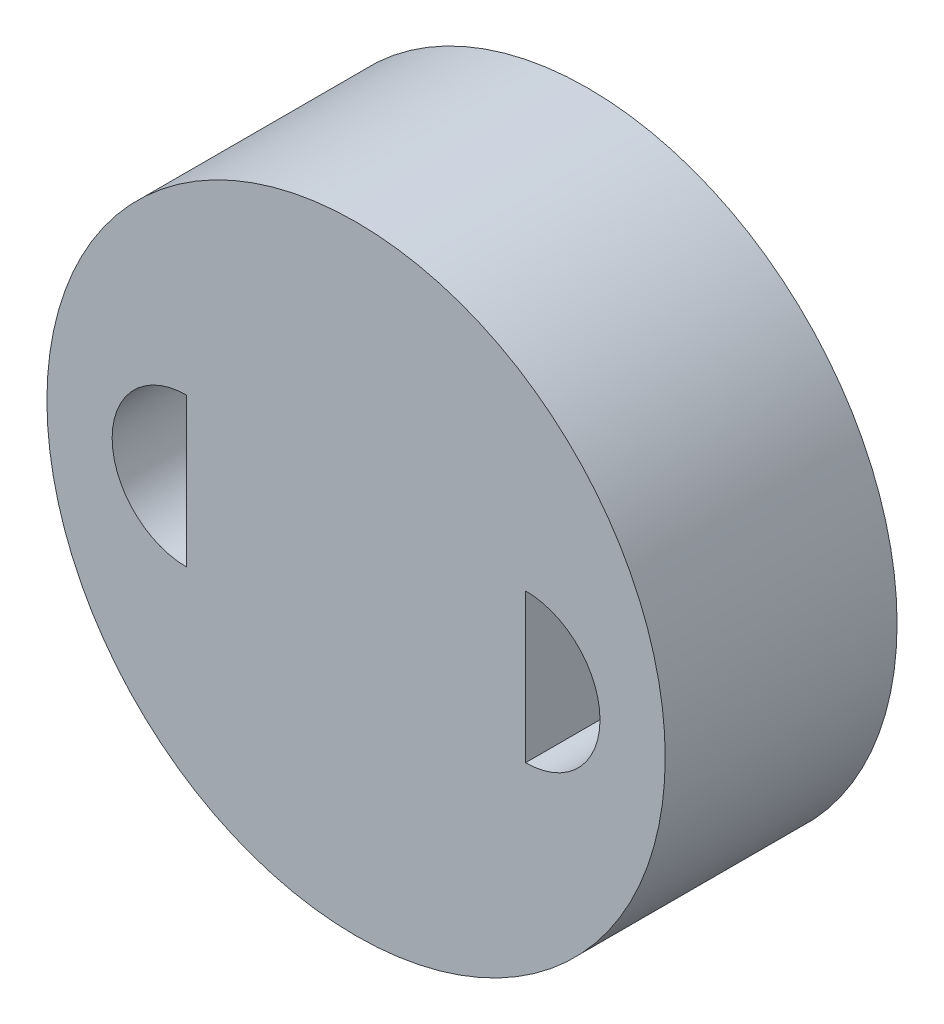
ISO-10303-21;
HEADER;
FILE_DESCRIPTION(('STEP AP214'),'2;1');
FILE_NAME('part.step','',(''),(''),'','','');
FILE_SCHEMA(('AUTOMOTIVE_DESIGN { 1 0 10303 214 1 1 1 1 }'));
ENDSEC;
DATA;
#1=APPLICATION_CONTEXT('core data for automotive mechanical design processes');
#2=APPLICATION_PROTOCOL_DEFINITION('international standard','automotive_design',2000,#1);
#3=PRODUCT_CONTEXT('',#1,'mechanical');
#4=PRODUCT('Part','Part','',(#3));
#5=PRODUCT_RELATED_PRODUCT_CATEGORY('part','',(#4));
#6=PRODUCT_DEFINITION_FORMATION('','',#4);
#7=PRODUCT_DEFINITION_CONTEXT('part definition',#1,'design');
#8=PRODUCT_DEFINITION('design','',#6,#7);
#9=PRODUCT_DEFINITION_SHAPE('','',#8);
#10=(LENGTH_UNIT() NAMED_UNIT(*) SI_UNIT(.MILLI.,.METRE.));
#11=(NAMED_UNIT(*) PLANE_ANGLE_UNIT() SI_UNIT($,.RADIAN.));
#12=(NAMED_UNIT(*) SI_UNIT($,.STERADIAN.) SOLID_ANGLE_UNIT());
#13=UNCERTAINTY_MEASURE_WITH_UNIT(LENGTH_MEASURE(1.E-05),#10,'distance_accuracy_value','');
#14=(GEOMETRIC_REPRESENTATION_CONTEXT(3) GLOBAL_UNCERTAINTY_ASSIGNED_CONTEXT((#13)) GLOBAL_UNIT_ASSIGNED_CONTEXT((#10,
#11,#12)) REPRESENTATION_CONTEXT('',''));
#15=CARTESIAN_POINT('',(0.,0.,0.));
#16=DIRECTION('',(0.,0.,1.));
#17=DIRECTION('',(1.,0.,0.));
#18=AXIS2_PLACEMENT_3D('',#15,#16,#17);
#19=CARTESIAN_POINT('',(0.,0.,76.2));
#20=DIRECTION('',(0.,0.,1.));
#21=DIRECTION('',(1.,0.,0.));
#22=AXIS2_PLACEMENT_3D('',#19,#20,#21);
#23=PLANE('',#22);
#24=DIRECTION('',(0.,1.,0.));
#25=VECTOR('',#24,1.);
#26=CARTESIAN_POINT('',(55.7030268418047,0.,76.2));
#27=LINE('',#26,#25);
#28=CARTESIAN_POINT('',(55.7030268418047,24.4621758088346,76.2));
#29=VERTEX_POINT('',#28);
#30=CARTESIAN_POINT('',(55.7030268418047,-24.4621758088346,76.2));
#31=VERTEX_POINT('',#30);
#32=EDGE_CURVE('E106',#29,#31,#27,.F.);
#33=ORIENTED_EDGE('',*,*,#32,.F.);
#34=CARTESIAN_POINT('',(55.7030268418047,0.,76.2));
#35=DIRECTION('',(0.,0.,1.));
#36=DIRECTION('',(1.,0.,0.));
#37=AXIS2_PLACEMENT_3D('',#34,#35,#36);
#38=CIRCLE('',#37,24.4621758088346);
#39=EDGE_CURVE('E94',#31,#29,#38,.T.);
#40=ORIENTED_EDGE('',*,*,#39,.F.);
#41=EDGE_LOOP('',(#33,#40));
#42=FACE_BOUND('',#41,.T.);
#43=CARTESIAN_POINT('',(0.,0.,76.2));
#44=DIRECTION('',(0.,0.,1.));
#45=DIRECTION('',(1.,0.,0.));
#46=AXIS2_PLACEMENT_3D('',#43,#44,#45);
#47=CIRCLE('',#46,101.6);
#48=CARTESIAN_POINT('',(-101.6,0.,76.2));
#49=VERTEX_POINT('',#48);
#50=EDGE_CURVE('E11',#49,#49,#47,.T.);
#51=ORIENTED_EDGE('',*,*,#50,.T.);
#52=EDGE_LOOP('',(#51));
#53=FACE_BOUND('',#52,.T.);
#54=DIRECTION('',(0.,1.,0.));
#55=VECTOR('',#54,1.);
#56=CARTESIAN_POINT('',(-55.7030268418047,0.,76.2));
#57=LINE('',#56,#55);
#58=CARTESIAN_POINT('',(-55.7030268418047,24.4621758088346,76.2));
#59=VERTEX_POINT('',#58);
#60=CARTESIAN_POINT('',(-55.7030268418047,-24.4621758088346,76.2));
#61=VERTEX_POINT('',#60);
#62=EDGE_CURVE('E108',#59,#61,#57,.F.);
#63=ORIENTED_EDGE('',*,*,#62,.T.);
#64=CARTESIAN_POINT('',(-55.7030268418047,0.,76.2));
#65=DIRECTION('',(0.,0.,1.));
#66=DIRECTION('',(1.,0.,0.));
#67=AXIS2_PLACEMENT_3D('',#64,#65,#66);
#68=CIRCLE('',#67,24.4621758088346);
#69=EDGE_CURVE('E40',#61,#59,#68,.F.);
#70=ORIENTED_EDGE('',*,*,#69,.T.);
#71=EDGE_LOOP('',(#63,#70));
#72=FACE_BOUND('',#71,.T.);
#73=ADVANCED_FACE('F36',(#42,#53,#72),#23,.T.);
#74=CARTESIAN_POINT('',(0.,0.,0.));
#75=DIRECTION('',(0.,0.,1.));
#76=DIRECTION('',(1.,0.,0.));
#77=AXIS2_PLACEMENT_3D('',#74,#75,#76);
#78=PLANE('',#77);
#79=CARTESIAN_POINT('',(0.,0.,0.));
#80=DIRECTION('',(0.,0.,1.));
#81=DIRECTION('',(1.,0.,0.));
#82=AXIS2_PLACEMENT_3D('',#79,#80,#81);
#83=CIRCLE('',#82,101.6);
#84=CARTESIAN_POINT('',(-101.6,0.,0.));
#85=VERTEX_POINT('',#84);
#86=EDGE_CURVE('E46',#85,#85,#83,.T.);
#87=ORIENTED_EDGE('',*,*,#86,.F.);
#88=EDGE_LOOP('',(#87));
#89=FACE_BOUND('',#88,.T.);
#90=CARTESIAN_POINT('',(55.7030268418047,0.,0.));
#91=DIRECTION('',(0.,0.,1.));
#92=DIRECTION('',(1.,0.,0.));
#93=AXIS2_PLACEMENT_3D('',#90,#91,#92);
#94=CIRCLE('',#93,24.4621758088346);
#95=CARTESIAN_POINT('',(55.7030268418047,-24.4621758088346,0.));
#96=VERTEX_POINT('',#95);
#97=CARTESIAN_POINT('',(55.7030268418047,24.4621758088346,0.));
#98=VERTEX_POINT('',#97);
#99=EDGE_CURVE('E99',#96,#98,#94,.T.);
#100=ORIENTED_EDGE('',*,*,#99,.T.);
#101=DIRECTION('',(0.,-1.,0.));
#102=VECTOR('',#101,1.);
#103=CARTESIAN_POINT('',(55.7030268418047,0.,0.));
#104=LINE('',#103,#102);
#105=EDGE_CURVE('E96',#98,#96,#104,.T.);
#106=ORIENTED_EDGE('',*,*,#105,.T.);
#107=EDGE_LOOP('',(#100,#106));
#108=FACE_BOUND('',#107,.T.);
#109=CARTESIAN_POINT('',(-55.7030268418047,0.,0.));
#110=DIRECTION('',(0.,0.,1.));
#111=DIRECTION('',(1.,0.,0.));
#112=AXIS2_PLACEMENT_3D('',#109,#110,#111);
#113=CIRCLE('',#112,24.4621758088346);
#114=CARTESIAN_POINT('',(-55.7030268418047,-24.4621758088346,0.));
#115=VERTEX_POINT('',#114);
#116=CARTESIAN_POINT('',(-55.7030268418047,24.4621758088346,0.));
#117=VERTEX_POINT('',#116);
#118=EDGE_CURVE('E80',#115,#117,#113,.F.);
#119=ORIENTED_EDGE('',*,*,#118,.F.);
#120=DIRECTION('',(0.,-1.,0.));
#121=VECTOR('',#120,1.);
#122=CARTESIAN_POINT('',(-55.7030268418047,0.,0.));
#123=LINE('',#122,#121);
#124=EDGE_CURVE('E73',#117,#115,#123,.T.);
#125=ORIENTED_EDGE('',*,*,#124,.F.);
#126=EDGE_LOOP('',(#119,#125));
#127=FACE_BOUND('',#126,.T.);
#128=ADVANCED_FACE('F87',(#89,#108,#127),#78,.F.);
#129=CARTESIAN_POINT('',(0.,0.,76.2));
#130=DIRECTION('',(0.,0.,-1.));
#131=DIRECTION('',(-1.,0.,0.));
#132=AXIS2_PLACEMENT_3D('',#129,#130,#131);
#133=CYLINDRICAL_SURFACE('',#132,101.6);
#134=CARTESIAN_POINT('',(-101.6,0.,76.2));
#135=CARTESIAN_POINT('',(-101.6,0.,75.40625));
#136=CARTESIAN_POINT('',(-101.6,0.,74.6125));
#137=CARTESIAN_POINT('',(-101.6,0.,73.025));
#138=CARTESIAN_POINT('',(-101.6,0.,72.23125));
#139=CARTESIAN_POINT('',(-101.6,0.,70.64375));
#140=CARTESIAN_POINT('',(-101.6,0.,69.85));
#141=CARTESIAN_POINT('',(-101.6,0.,68.2625));
#142=CARTESIAN_POINT('',(-101.6,0.,67.46875));
#143=CARTESIAN_POINT('',(-101.6,0.,65.88125));
#144=CARTESIAN_POINT('',(-101.6,0.,65.0875));
#145=CARTESIAN_POINT('',(-101.6,0.,63.5));
#146=CARTESIAN_POINT('',(-101.6,0.,62.70625));
#147=CARTESIAN_POINT('',(-101.6,0.,61.11875));
#148=CARTESIAN_POINT('',(-101.6,0.,60.325));
#149=CARTESIAN_POINT('',(-101.6,0.,58.7375));
#150=CARTESIAN_POINT('',(-101.6,0.,57.94375));
#151=CARTESIAN_POINT('',(-101.6,0.,56.35625));
#152=CARTESIAN_POINT('',(-101.6,0.,55.5625));
#153=CARTESIAN_POINT('',(-101.6,0.,53.975));
#154=CARTESIAN_POINT('',(-101.6,0.,53.18125));
#155=CARTESIAN_POINT('',(-101.6,0.,51.59375));
#156=CARTESIAN_POINT('',(-101.6,0.,50.8));
#157=CARTESIAN_POINT('',(-101.6,0.,49.2125));
#158=CARTESIAN_POINT('',(-101.6,0.,48.41875));
#159=CARTESIAN_POINT('',(-101.6,0.,46.83125));
#160=CARTESIAN_POINT('',(-101.6,0.,46.0375));
#161=CARTESIAN_POINT('',(-101.6,0.,44.45));
#162=CARTESIAN_POINT('',(-101.6,0.,43.65625));
#163=CARTESIAN_POINT('',(-101.6,0.,42.06875));
#164=CARTESIAN_POINT('',(-101.6,0.,41.275));
#165=CARTESIAN_POINT('',(-101.6,0.,39.6875));
#166=CARTESIAN_POINT('',(-101.6,0.,38.89375));
#167=CARTESIAN_POINT('',(-101.6,0.,37.30625));
#168=CARTESIAN_POINT('',(-101.6,0.,36.5125));
#169=CARTESIAN_POINT('',(-101.6,0.,34.925));
#170=CARTESIAN_POINT('',(-101.6,0.,34.13125));
#171=CARTESIAN_POINT('',(-101.6,0.,32.54375));
#172=CARTESIAN_POINT('',(-101.6,0.,31.75));
#173=CARTESIAN_POINT('',(-101.6,0.,30.1625));
#174=CARTESIAN_POINT('',(-101.6,0.,29.36875));
#175=CARTESIAN_POINT('',(-101.6,0.,27.78125));
#176=CARTESIAN_POINT('',(-101.6,0.,26.9875));
#177=CARTESIAN_POINT('',(-101.6,0.,25.4));
#178=CARTESIAN_POINT('',(-101.6,0.,24.60625));
#179=CARTESIAN_POINT('',(-101.6,0.,23.01875));
#180=CARTESIAN_POINT('',(-101.6,0.,22.225));
#181=CARTESIAN_POINT('',(-101.6,0.,20.6375));
#182=CARTESIAN_POINT('',(-101.6,0.,19.84375));
#183=CARTESIAN_POINT('',(-101.6,0.,18.25625));
#184=CARTESIAN_POINT('',(-101.6,0.,17.4625));
#185=CARTESIAN_POINT('',(-101.6,0.,15.875));
#186=CARTESIAN_POINT('',(-101.6,0.,15.08125));
#187=CARTESIAN_POINT('',(-101.6,0.,13.49375));
#188=CARTESIAN_POINT('',(-101.6,0.,12.7));
#189=CARTESIAN_POINT('',(-101.6,0.,11.1125));
#190=CARTESIAN_POINT('',(-101.6,0.,10.31875));
#191=CARTESIAN_POINT('',(-101.6,0.,8.73125));
#192=CARTESIAN_POINT('',(-101.6,0.,7.93750000000001));
#193=CARTESIAN_POINT('',(-101.6,0.,6.35));
#194=CARTESIAN_POINT('',(-101.6,0.,5.55625));
#195=CARTESIAN_POINT('',(-101.6,0.,3.96875));
#196=CARTESIAN_POINT('',(-101.6,0.,3.175));
#197=CARTESIAN_POINT('',(-101.6,0.,1.5875));
#198=CARTESIAN_POINT('',(-101.6,0.,0.793750000000001));
#199=CARTESIAN_POINT('',(-101.6,0.,0.));
#200=B_SPLINE_CURVE_WITH_KNOTS('',3,(#134,#135,#136,#137,#138,#139,#140,#141,#142,#143,#144,
#145,#146,#147,#148,#149,#150,#151,#152,#153,#154,#155,#156,#157,#158,#159,#160,#161,#162,#163,
#164,#165,#166,#167,#168,#169,#170,#171,#172,#173,#174,#175,#176,#177,#178,#179,#180,#181,#182,
#183,#184,#185,#186,#187,#188,#189,#190,#191,#192,#193,#194,#195,#196,#197,#198,#199),
.UNSPECIFIED.,.F.,.F.,(4,2,2,2,2,2,2,2,2,2,2,2,2,2,2,2,2,2,2,2,2,2,2,2,2,2,2,2,2,2,2,2,4),(0.,
2.38125,4.7625,7.14375,9.52500000000001,11.90625,14.2875,16.66875,19.05,21.43125,23.8125,
26.19375,28.575,30.95625,33.3375,35.71875,38.1,40.48125,42.8625,45.24375,47.625,50.00625,
52.3875,54.76875,57.15,59.53125,61.9125,64.29375,66.675,69.05625,71.4375,73.81875,76.2),.UNSPECIFIED.);
#201=EDGE_CURVE('BSEAM38',#49,#85,#200,.T.);
#202=ORIENTED_EDGE('',*,*,#50,.F.);
#203=ORIENTED_EDGE('',*,*,#86,.T.);
#204=ORIENTED_EDGE('',*,*,#201,.T.);
#205=ORIENTED_EDGE('',*,*,#201,.F.);
#206=EDGE_LOOP('',(#202,#204,#203,#205));
#207=FACE_BOUND('',#206,.T.);
#208=ADVANCED_FACE('F38',(#207),#133,.T.);
#209=CARTESIAN_POINT('',(55.7030268418047,0.,0.));
#210=DIRECTION('',(-1.,0.,0.));
#211=DIRECTION('',(0.,0.,1.));
#212=AXIS2_PLACEMENT_3D('',#209,#210,#211);
#213=PLANE('',#212);
#214=ORIENTED_EDGE('',*,*,#32,.T.);
#215=DIRECTION('',(0.,0.,1.));
#216=VECTOR('',#215,1.);
#217=CARTESIAN_POINT('',(55.7030268418047,-24.4621758088346,0.));
#218=LINE('',#217,#216);
#219=EDGE_CURVE('E91',#96,#31,#218,.T.);
#220=ORIENTED_EDGE('',*,*,#219,.F.);
#221=ORIENTED_EDGE('',*,*,#105,.F.);
#222=DIRECTION('',(0.,0.,1.));
#223=VECTOR('',#222,1.);
#224=CARTESIAN_POINT('',(55.7030268418047,24.4621758088346,0.));
#225=LINE('',#224,#223);
#226=EDGE_CURVE('E88',#98,#29,#225,.T.);
#227=ORIENTED_EDGE('',*,*,#226,.T.);
#228=EDGE_LOOP('',(#214,#220,#221,#227));
#229=FACE_BOUND('',#228,.T.);
#230=ADVANCED_FACE('F120',(#229),#213,.F.);
#231=CARTESIAN_POINT('',(55.7030268418047,0.,0.));
#232=DIRECTION('',(0.,0.,1.));
#233=DIRECTION('',(1.,0.,0.));
#234=AXIS2_PLACEMENT_3D('',#231,#232,#233);
#235=CYLINDRICAL_SURFACE('',#234,24.4621758088346);
#236=ORIENTED_EDGE('',*,*,#39,.T.);
#237=ORIENTED_EDGE('',*,*,#226,.F.);
#238=ORIENTED_EDGE('',*,*,#99,.F.);
#239=ORIENTED_EDGE('',*,*,#219,.T.);
#240=EDGE_LOOP('',(#236,#237,#238,#239));
#241=FACE_BOUND('',#240,.T.);
#242=ADVANCED_FACE('F123',(#241),#235,.F.);
#243=CARTESIAN_POINT('',(-55.7030268418047,0.,0.));
#244=DIRECTION('',(0.,0.,1.));
#245=DIRECTION('',(1.,0.,0.));
#246=AXIS2_PLACEMENT_3D('',#243,#244,#245);
#247=CYLINDRICAL_SURFACE('',#246,24.4621758088346);
#248=DIRECTION('',(0.,0.,1.));
#249=VECTOR('',#248,1.);
#250=CARTESIAN_POINT('',(-55.7030268418047,-24.4621758088346,0.));
#251=LINE('',#250,#249);
#252=EDGE_CURVE('E54',#115,#61,#251,.T.);
#253=ORIENTED_EDGE('',*,*,#252,.F.);
#254=ORIENTED_EDGE('',*,*,#118,.T.);
#255=DIRECTION('',(0.,0.,1.));
#256=VECTOR('',#255,1.);
#257=CARTESIAN_POINT('',(-55.7030268418047,24.4621758088346,0.));
#258=LINE('',#257,#256);
#259=EDGE_CURVE('E76',#117,#59,#258,.T.);
#260=ORIENTED_EDGE('',*,*,#259,.T.);
#261=ORIENTED_EDGE('',*,*,#69,.F.);
#262=EDGE_LOOP('',(#253,#254,#260,#261));
#263=FACE_BOUND('',#262,.T.);
#264=ADVANCED_FACE('F83',(#263),#247,.F.);
#265=CARTESIAN_POINT('',(-55.7030268418047,0.,0.));
#266=DIRECTION('',(-1.,0.,0.));
#267=DIRECTION('',(0.,0.,1.));
#268=AXIS2_PLACEMENT_3D('',#265,#266,#267);
#269=PLANE('',#268);
#270=ORIENTED_EDGE('',*,*,#259,.F.);
#271=ORIENTED_EDGE('',*,*,#124,.T.);
#272=ORIENTED_EDGE('',*,*,#252,.T.);
#273=ORIENTED_EDGE('',*,*,#62,.F.);
#274=EDGE_LOOP('',(#270,#271,#272,#273));
#275=FACE_BOUND('',#274,.T.);
#276=ADVANCED_FACE('F74',(#275),#269,.T.);
#277=CLOSED_SHELL('',(#73,#128,#208,#230,#242,#264,#276));
#278=MANIFOLD_SOLID_BREP('B2',#277);
#279=ADVANCED_BREP_SHAPE_REPRESENTATION('',(#18,#278),#14);
#280=SHAPE_DEFINITION_REPRESENTATION(#9,#279);
ENDSEC;
END-ISO-10303-21;
